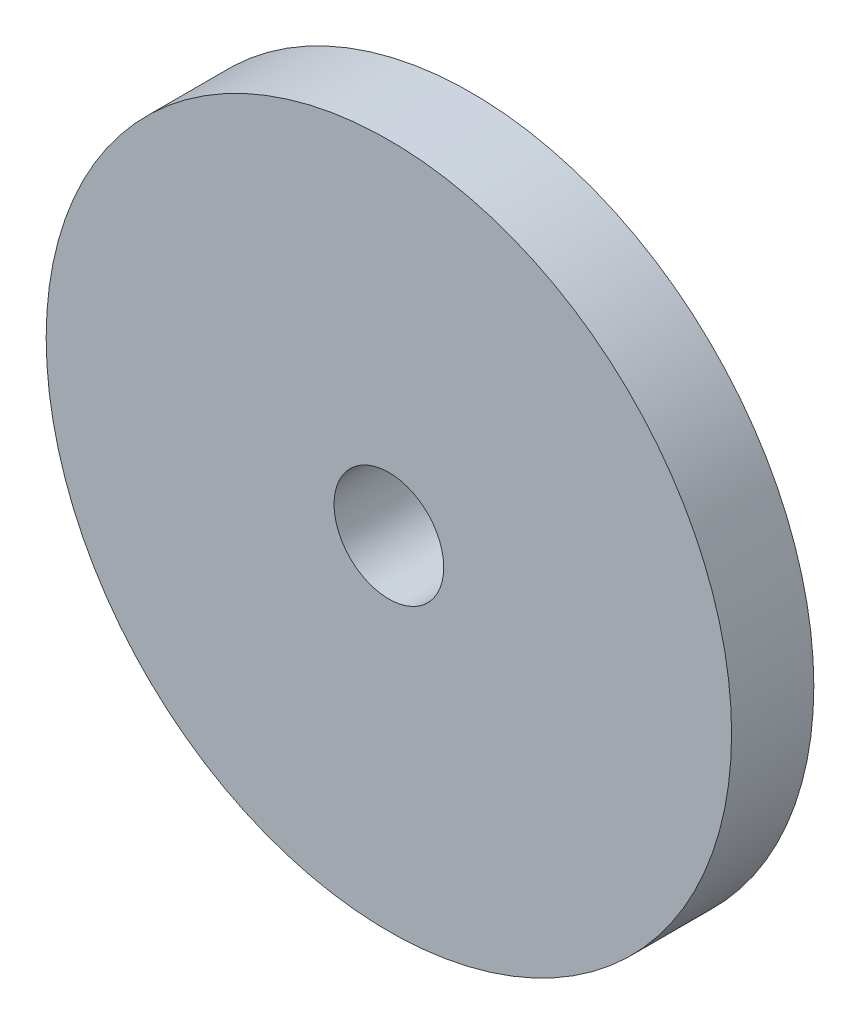
ISO-10303-21;
HEADER;
FILE_DESCRIPTION(('STEP AP214'),'2;1');
FILE_NAME('part.step','',(''),(''),'','','');
FILE_SCHEMA(('AUTOMOTIVE_DESIGN { 1 0 10303 214 1 1 1 1 }'));
ENDSEC;
DATA;
#1=APPLICATION_CONTEXT('core data for automotive mechanical design processes');
#2=APPLICATION_PROTOCOL_DEFINITION('international standard','automotive_design',2000,#1);
#3=PRODUCT_CONTEXT('',#1,'mechanical');
#4=PRODUCT('Part','Part','',(#3));
#5=PRODUCT_RELATED_PRODUCT_CATEGORY('part','',(#4));
#6=PRODUCT_DEFINITION_FORMATION('','',#4);
#7=PRODUCT_DEFINITION_CONTEXT('part definition',#1,'design');
#8=PRODUCT_DEFINITION('design','',#6,#7);
#9=PRODUCT_DEFINITION_SHAPE('','',#8);
#10=(LENGTH_UNIT() NAMED_UNIT(*) SI_UNIT(.MILLI.,.METRE.));
#11=(NAMED_UNIT(*) PLANE_ANGLE_UNIT() SI_UNIT($,.RADIAN.));
#12=(NAMED_UNIT(*) SI_UNIT($,.STERADIAN.) SOLID_ANGLE_UNIT());
#13=UNCERTAINTY_MEASURE_WITH_UNIT(LENGTH_MEASURE(1.E-05),#10,'distance_accuracy_value','');
#14=(GEOMETRIC_REPRESENTATION_CONTEXT(3) GLOBAL_UNCERTAINTY_ASSIGNED_CONTEXT((#13)) GLOBAL_UNIT_ASSIGNED_CONTEXT((#10,
#11,#12)) REPRESENTATION_CONTEXT('',''));
#15=CARTESIAN_POINT('',(0.,0.,0.));
#16=DIRECTION('',(0.,0.,1.));
#17=DIRECTION('',(1.,0.,0.));
#18=AXIS2_PLACEMENT_3D('',#15,#16,#17);
#19=CARTESIAN_POINT('',(0.,0.,6.));
#20=DIRECTION('',(0.,0.,-1.));
#21=DIRECTION('',(-1.,0.,0.));
#22=AXIS2_PLACEMENT_3D('',#19,#20,#21);
#23=CYLINDRICAL_SURFACE('',#22,25.);
#24=CARTESIAN_POINT('',(0.,0.,6.));
#25=DIRECTION('',(0.,0.,1.));
#26=DIRECTION('',(1.,0.,0.));
#27=AXIS2_PLACEMENT_3D('',#24,#25,#26);
#28=CIRCLE('',#27,25.);
#29=CARTESIAN_POINT('',(25.,0.,6.));
#30=VERTEX_POINT('',#29);
#31=EDGE_CURVE('E10',#30,#30,#28,.T.);
#32=ORIENTED_EDGE('',*,*,#31,.F.);
#33=EDGE_LOOP('',(#32));
#34=FACE_BOUND('',#33,.T.);
#35=CARTESIAN_POINT('',(0.,0.,0.));
#36=DIRECTION('',(0.,0.,1.));
#37=DIRECTION('',(1.,0.,0.));
#38=AXIS2_PLACEMENT_3D('',#35,#36,#37);
#39=CIRCLE('',#38,25.);
#40=CARTESIAN_POINT('',(25.,0.,0.));
#41=VERTEX_POINT('',#40);
#42=EDGE_CURVE('E33',#41,#41,#39,.T.);
#43=ORIENTED_EDGE('',*,*,#42,.T.);
#44=EDGE_LOOP('',(#43));
#45=FACE_BOUND('',#44,.T.);
#46=ADVANCED_FACE('F30',(#34,#45),#23,.T.);
#47=CARTESIAN_POINT('',(0.,0.,6.));
#48=DIRECTION('',(0.,0.,1.));
#49=DIRECTION('',(1.,0.,0.));
#50=AXIS2_PLACEMENT_3D('',#47,#48,#49);
#51=PLANE('',#50);
#52=CARTESIAN_POINT('',(0.,0.,6.));
#53=DIRECTION('',(0.,0.,1.));
#54=DIRECTION('',(1.,0.,0.));
#55=AXIS2_PLACEMENT_3D('',#52,#53,#54);
#56=CIRCLE('',#55,4.);
#57=CARTESIAN_POINT('',(4.,0.,6.));
#58=VERTEX_POINT('',#57);
#59=EDGE_CURVE('E42',#58,#58,#56,.T.);
#60=ORIENTED_EDGE('',*,*,#59,.F.);
#61=EDGE_LOOP('',(#60));
#62=FACE_BOUND('',#61,.T.);
#63=ORIENTED_EDGE('',*,*,#31,.T.);
#64=EDGE_LOOP('',(#63));
#65=FACE_BOUND('',#64,.T.);
#66=ADVANCED_FACE('F57',(#62,#65),#51,.T.);
#67=CARTESIAN_POINT('',(0.,0.,0.));
#68=DIRECTION('',(0.,0.,1.));
#69=DIRECTION('',(1.,0.,0.));
#70=AXIS2_PLACEMENT_3D('',#67,#68,#69);
#71=PLANE('',#70);
#72=CARTESIAN_POINT('',(0.,0.,0.));
#73=DIRECTION('',(0.,0.,1.));
#74=DIRECTION('',(1.,0.,0.));
#75=AXIS2_PLACEMENT_3D('',#72,#73,#74);
#76=CIRCLE('',#75,4.);
#77=CARTESIAN_POINT('',(4.,0.,0.));
#78=VERTEX_POINT('',#77);
#79=EDGE_CURVE('E40',#78,#78,#76,.T.);
#80=ORIENTED_EDGE('',*,*,#79,.T.);
#81=EDGE_LOOP('',(#80));
#82=FACE_BOUND('',#81,.T.);
#83=ORIENTED_EDGE('',*,*,#42,.F.);
#84=EDGE_LOOP('',(#83));
#85=FACE_BOUND('',#84,.T.);
#86=ADVANCED_FACE('F48',(#82,#85),#71,.F.);
#87=CARTESIAN_POINT('',(0.,0.,0.));
#88=DIRECTION('',(0.,0.,1.));
#89=DIRECTION('',(1.,0.,0.));
#90=AXIS2_PLACEMENT_3D('',#87,#88,#89);
#91=CYLINDRICAL_SURFACE('',#90,4.);
#92=ORIENTED_EDGE('',*,*,#79,.F.);
#93=EDGE_LOOP('',(#92));
#94=FACE_BOUND('',#93,.T.);
#95=ORIENTED_EDGE('',*,*,#59,.T.);
#96=EDGE_LOOP('',(#95));
#97=FACE_BOUND('',#96,.T.);
#98=ADVANCED_FACE('F51',(#94,#97),#91,.F.);
#99=CLOSED_SHELL('',(#46,#66,#86,#98));
#100=MANIFOLD_SOLID_BREP('B2',#99);
#101=ADVANCED_BREP_SHAPE_REPRESENTATION('',(#18,#100),#14);
#102=SHAPE_DEFINITION_REPRESENTATION(#9,#101);
ENDSEC;
END-ISO-10303-21;
